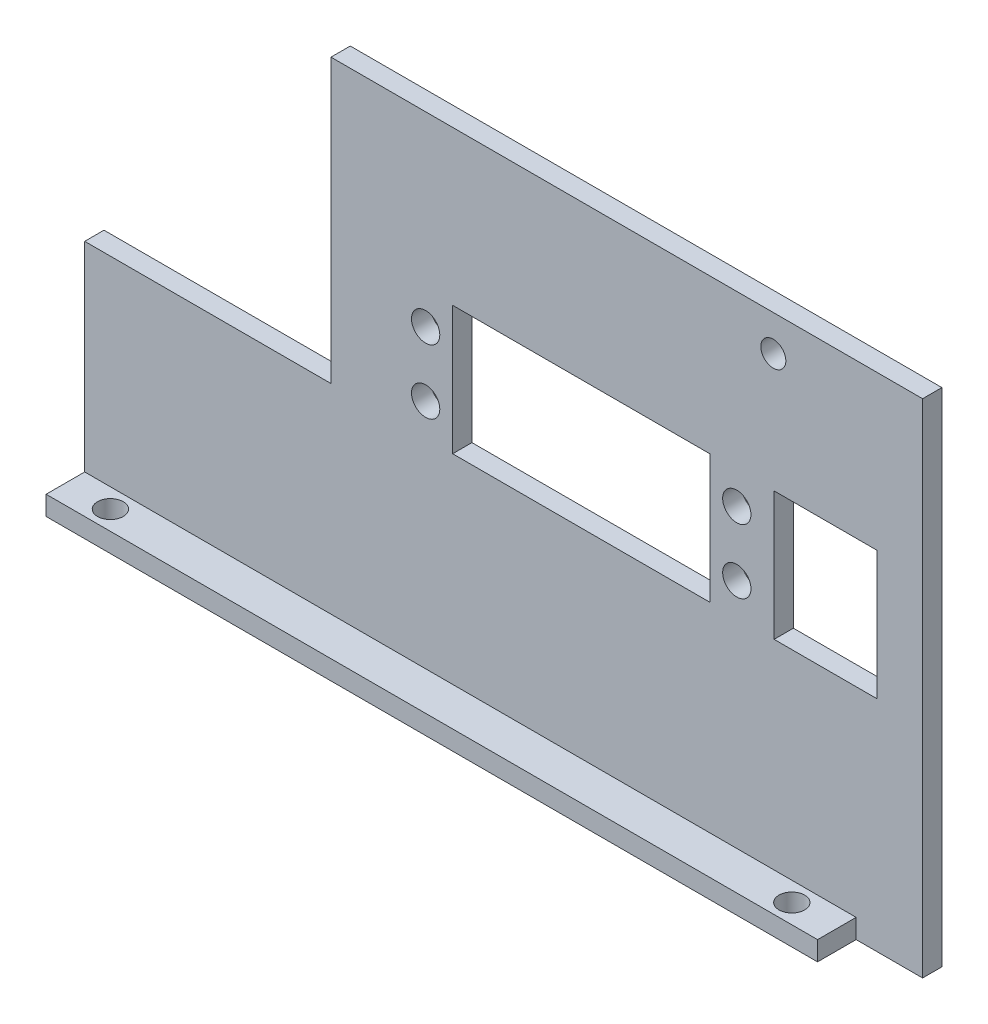
ISO-10303-21;
HEADER;
FILE_DESCRIPTION(('STEP AP214'),'2;1');
FILE_NAME('part.step','',(''),(''),'','','');
FILE_SCHEMA(('AUTOMOTIVE_DESIGN { 1 0 10303 214 1 1 1 1 }'));
ENDSEC;
DATA;
#1=APPLICATION_CONTEXT('core data for automotive mechanical design processes');
#2=APPLICATION_PROTOCOL_DEFINITION('international standard','automotive_design',2000,#1);
#3=PRODUCT_CONTEXT('',#1,'mechanical');
#4=PRODUCT('Part','Part','',(#3));
#5=PRODUCT_RELATED_PRODUCT_CATEGORY('part','',(#4));
#6=PRODUCT_DEFINITION_FORMATION('','',#4);
#7=PRODUCT_DEFINITION_CONTEXT('part definition',#1,'design');
#8=PRODUCT_DEFINITION('design','',#6,#7);
#9=PRODUCT_DEFINITION_SHAPE('','',#8);
#10=(LENGTH_UNIT() NAMED_UNIT(*) SI_UNIT(.MILLI.,.METRE.));
#11=(NAMED_UNIT(*) PLANE_ANGLE_UNIT() SI_UNIT($,.RADIAN.));
#12=(NAMED_UNIT(*) SI_UNIT($,.STERADIAN.) SOLID_ANGLE_UNIT());
#13=UNCERTAINTY_MEASURE_WITH_UNIT(LENGTH_MEASURE(1.E-05),#10,'distance_accuracy_value','');
#14=(GEOMETRIC_REPRESENTATION_CONTEXT(3) GLOBAL_UNCERTAINTY_ASSIGNED_CONTEXT((#13)) GLOBAL_UNIT_ASSIGNED_CONTEXT((#10,
#11,#12)) REPRESENTATION_CONTEXT('',''));
#15=CARTESIAN_POINT('',(0.,0.,0.));
#16=DIRECTION('',(0.,0.,1.));
#17=DIRECTION('',(1.,0.,0.));
#18=AXIS2_PLACEMENT_3D('',#15,#16,#17);
#19=CARTESIAN_POINT('',(0.,0.,1.5));
#20=DIRECTION('',(0.,0.,1.));
#21=DIRECTION('',(1.,0.,0.));
#22=AXIS2_PLACEMENT_3D('',#19,#20,#21);
#23=PLANE('',#22);
#24=DIRECTION('',(-1.,0.,0.));
#25=VECTOR('',#24,1.);
#26=CARTESIAN_POINT('',(81.6037037170651,-42.3491391233582,1.5));
#27=LINE('',#26,#25);
#28=CARTESIAN_POINT('',(81.6037037170651,-42.3491391233582,1.5));
#29=VERTEX_POINT('',#28);
#30=CARTESIAN_POINT('',(-38.3962962829349,-42.3491391233582,1.5));
#31=VERTEX_POINT('',#30);
#32=EDGE_CURVE('E179',#29,#31,#27,.T.);
#33=ORIENTED_EDGE('',*,*,#32,.F.);
#34=DIRECTION('',(0.,1.,0.));
#35=VECTOR('',#34,1.);
#36=CARTESIAN_POINT('',(81.6037037170651,-45.3491391233582,1.5));
#37=LINE('',#36,#35);
#38=CARTESIAN_POINT('',(81.6037037170651,-45.3491391233582,1.5));
#39=VERTEX_POINT('',#38);
#40=EDGE_CURVE('E49',#39,#29,#37,.T.);
#41=ORIENTED_EDGE('',*,*,#40,.F.);
#42=DIRECTION('',(1.,0.,0.));
#43=VECTOR('',#42,1.);
#44=CARTESIAN_POINT('',(-38.3962962829349,-45.3491391233582,1.5));
#45=LINE('',#44,#43);
#46=CARTESIAN_POINT('',(91.9435635315684,-45.3491391233582,1.5));
#47=VERTEX_POINT('',#46);
#48=EDGE_CURVE('E299',#39,#47,#45,.T.);
#49=ORIENTED_EDGE('',*,*,#48,.T.);
#50=DIRECTION('',(0.,1.,0.));
#51=VECTOR('',#50,1.);
#52=CARTESIAN_POINT('',(91.9435635315684,32.6887387273635,1.5));
#53=LINE('',#52,#51);
#54=CARTESIAN_POINT('',(91.9435635315684,32.6887387273635,1.5));
#55=VERTEX_POINT('',#54);
#56=EDGE_CURVE('E288',#47,#55,#53,.T.);
#57=ORIENTED_EDGE('',*,*,#56,.T.);
#58=DIRECTION('',(-1.,0.,0.));
#59=VECTOR('',#58,1.);
#60=CARTESIAN_POINT('',(-0.0842383477554077,32.6887387273635,1.5));
#61=LINE('',#60,#59);
#62=CARTESIAN_POINT('',(-0.0842383477554077,32.6887387273635,1.5));
#63=VERTEX_POINT('',#62);
#64=EDGE_CURVE('E291',#55,#63,#61,.T.);
#65=ORIENTED_EDGE('',*,*,#64,.T.);
#66=DIRECTION('',(0.,-1.,0.));
#67=VECTOR('',#66,1.);
#68=CARTESIAN_POINT('',(-0.0842383477554072,8.72215593269896,1.5));
#69=LINE('',#68,#67);
#70=CARTESIAN_POINT('',(-0.0842383477554047,-11.277844067301,1.5));
#71=VERTEX_POINT('',#70);
#72=EDGE_CURVE('E294',#63,#71,#69,.T.);
#73=ORIENTED_EDGE('',*,*,#72,.T.);
#74=DIRECTION('',(-1.,0.,0.));
#75=VECTOR('',#74,1.);
#76=CARTESIAN_POINT('',(-0.0842383477554047,-11.277844067301,1.5));
#77=LINE('',#76,#75);
#78=CARTESIAN_POINT('',(-38.3962962829349,-11.277844067301,1.5));
#79=VERTEX_POINT('',#78);
#80=EDGE_CURVE('E296',#71,#79,#77,.T.);
#81=ORIENTED_EDGE('',*,*,#80,.T.);
#82=DIRECTION('',(0.,-1.,0.));
#83=VECTOR('',#82,1.);
#84=CARTESIAN_POINT('',(-38.3962962829349,-11.277844067301,1.5));
#85=LINE('',#84,#83);
#86=EDGE_CURVE('E55',#79,#31,#85,.T.);
#87=ORIENTED_EDGE('',*,*,#86,.T.);
#88=EDGE_LOOP('',(#33,#41,#49,#57,#65,#73,#81,#87));
#89=FACE_BOUND('',#88,.T.);
#90=CARTESIAN_POINT('',(63.041461984655,3.72215593269896,1.5));
#91=DIRECTION('',(0.,0.,1.));
#92=DIRECTION('',(1.,0.,0.));
#93=AXIS2_PLACEMENT_3D('',#90,#91,#92);
#94=CIRCLE('',#93,2.2);
#95=CARTESIAN_POINT('',(65.241461984655,3.72215593269896,1.5));
#96=VERTEX_POINT('',#95);
#97=EDGE_CURVE('E233',#96,#96,#94,.T.);
#98=ORIENTED_EDGE('',*,*,#97,.F.);
#99=EDGE_LOOP('',(#98));
#100=FACE_BOUND('',#99,.T.);
#101=CARTESIAN_POINT('',(68.7194911646115,27.1397149575249,1.5));
#102=DIRECTION('',(0.,0.,1.));
#103=DIRECTION('',(1.,0.,0.));
#104=AXIS2_PLACEMENT_3D('',#101,#102,#103);
#105=CIRCLE('',#104,1.95);
#106=CARTESIAN_POINT('',(70.6694911646114,27.1397149575249,1.5));
#107=VERTEX_POINT('',#106);
#108=EDGE_CURVE('E245',#107,#107,#105,.T.);
#109=ORIENTED_EDGE('',*,*,#108,.F.);
#110=EDGE_LOOP('',(#109));
#111=FACE_BOUND('',#110,.T.);
#112=DIRECTION('',(1.,0.,0.));
#113=VECTOR('',#112,1.);
#114=CARTESIAN_POINT('',(68.841461984655,-11.277844067301,1.5));
#115=LINE('',#114,#113);
#116=CARTESIAN_POINT('',(68.841461984655,-11.277844067301,1.5));
#117=VERTEX_POINT('',#116);
#118=CARTESIAN_POINT('',(84.841461984655,-11.277844067301,1.5));
#119=VERTEX_POINT('',#118);
#120=EDGE_CURVE('E259',#117,#119,#115,.T.);
#121=ORIENTED_EDGE('',*,*,#120,.F.);
#122=DIRECTION('',(0.,-1.,0.));
#123=VECTOR('',#122,1.);
#124=CARTESIAN_POINT('',(68.841461984655,-11.277844067301,1.5));
#125=LINE('',#124,#123);
#126=CARTESIAN_POINT('',(68.841461984655,8.72215593269894,1.5));
#127=VERTEX_POINT('',#126);
#128=EDGE_CURVE('E257',#127,#117,#125,.T.);
#129=ORIENTED_EDGE('',*,*,#128,.F.);
#130=DIRECTION('',(-1.,0.,0.));
#131=VECTOR('',#130,1.);
#132=CARTESIAN_POINT('',(68.841461984655,8.72215593269894,1.5));
#133=LINE('',#132,#131);
#134=CARTESIAN_POINT('',(84.841461984655,8.72215593269894,1.5));
#135=VERTEX_POINT('',#134);
#136=EDGE_CURVE('E265',#135,#127,#133,.T.);
#137=ORIENTED_EDGE('',*,*,#136,.F.);
#138=DIRECTION('',(0.,1.,0.));
#139=VECTOR('',#138,1.);
#140=CARTESIAN_POINT('',(84.841461984655,-11.277844067301,1.5));
#141=LINE('',#140,#139);
#142=EDGE_CURVE('E262',#119,#135,#141,.T.);
#143=ORIENTED_EDGE('',*,*,#142,.F.);
#144=EDGE_LOOP('',(#121,#129,#137,#143));
#145=FACE_BOUND('',#144,.T.);
#146=CARTESIAN_POINT('',(14.641461984655,-6.27784406730104,1.5));
#147=DIRECTION('',(0.,0.,1.));
#148=DIRECTION('',(1.,0.,0.));
#149=AXIS2_PLACEMENT_3D('',#146,#147,#148);
#150=CIRCLE('',#149,2.2);
#151=CARTESIAN_POINT('',(16.841461984655,-6.27784406730104,1.5));
#152=VERTEX_POINT('',#151);
#153=EDGE_CURVE('E251',#152,#152,#150,.T.);
#154=ORIENTED_EDGE('',*,*,#153,.F.);
#155=EDGE_LOOP('',(#154));
#156=FACE_BOUND('',#155,.T.);
#157=CARTESIAN_POINT('',(14.641461984655,3.72215593269896,1.5));
#158=DIRECTION('',(0.,0.,1.));
#159=DIRECTION('',(1.,0.,0.));
#160=AXIS2_PLACEMENT_3D('',#157,#158,#159);
#161=CIRCLE('',#160,2.2);
#162=CARTESIAN_POINT('',(16.841461984655,3.72215593269896,1.5));
#163=VERTEX_POINT('',#162);
#164=EDGE_CURVE('E239',#163,#163,#161,.T.);
#165=ORIENTED_EDGE('',*,*,#164,.F.);
#166=EDGE_LOOP('',(#165));
#167=FACE_BOUND('',#166,.T.);
#168=CARTESIAN_POINT('',(63.041461984655,-6.27784406730104,1.5));
#169=DIRECTION('',(0.,0.,1.));
#170=DIRECTION('',(1.,0.,0.));
#171=AXIS2_PLACEMENT_3D('',#168,#169,#170);
#172=CIRCLE('',#171,2.2);
#173=CARTESIAN_POINT('',(65.241461984655,-6.27784406730104,1.5));
#174=VERTEX_POINT('',#173);
#175=EDGE_CURVE('E227',#174,#174,#172,.T.);
#176=ORIENTED_EDGE('',*,*,#175,.F.);
#177=EDGE_LOOP('',(#176));
#178=FACE_BOUND('',#177,.T.);
#179=DIRECTION('',(0.,-1.,0.));
#180=VECTOR('',#179,1.);
#181=CARTESIAN_POINT('',(18.841461984655,8.72215593269896,1.5));
#182=LINE('',#181,#180);
#183=CARTESIAN_POINT('',(18.841461984655,8.72215593269896,1.5));
#184=VERTEX_POINT('',#183);
#185=CARTESIAN_POINT('',(18.841461984655,-11.277844067301,1.5));
#186=VERTEX_POINT('',#185);
#187=EDGE_CURVE('E198',#184,#186,#182,.T.);
#188=ORIENTED_EDGE('',*,*,#187,.F.);
#189=DIRECTION('',(-1.,0.,0.));
#190=VECTOR('',#189,1.);
#191=CARTESIAN_POINT('',(18.841461984655,8.72215593269896,1.5));
#192=LINE('',#191,#190);
#193=CARTESIAN_POINT('',(58.841461984655,8.72215593269896,1.5));
#194=VERTEX_POINT('',#193);
#195=EDGE_CURVE('E196',#194,#184,#192,.T.);
#196=ORIENTED_EDGE('',*,*,#195,.F.);
#197=DIRECTION('',(0.,1.,0.));
#198=VECTOR('',#197,1.);
#199=CARTESIAN_POINT('',(58.841461984655,8.72215593269896,1.5));
#200=LINE('',#199,#198);
#201=CARTESIAN_POINT('',(58.841461984655,-11.277844067301,1.5));
#202=VERTEX_POINT('',#201);
#203=EDGE_CURVE('E204',#202,#194,#200,.T.);
#204=ORIENTED_EDGE('',*,*,#203,.F.);
#205=DIRECTION('',(1.,0.,0.));
#206=VECTOR('',#205,1.);
#207=CARTESIAN_POINT('',(18.841461984655,-11.277844067301,1.5));
#208=LINE('',#207,#206);
#209=EDGE_CURVE('E201',#186,#202,#208,.T.);
#210=ORIENTED_EDGE('',*,*,#209,.F.);
#211=EDGE_LOOP('',(#188,#196,#204,#210));
#212=FACE_BOUND('',#211,.T.);
#213=ADVANCED_FACE('F34',(#89,#100,#111,#145,#156,#167,#178,#212),#23,.T.);
#214=CARTESIAN_POINT('',(0.,0.,-1.5));
#215=DIRECTION('',(0.,0.,1.));
#216=DIRECTION('',(1.,0.,0.));
#217=AXIS2_PLACEMENT_3D('',#214,#215,#216);
#218=PLANE('',#217);
#219=CARTESIAN_POINT('',(63.041461984655,-6.27784406730104,-1.5));
#220=DIRECTION('',(0.,0.,1.));
#221=DIRECTION('',(1.,0.,0.));
#222=AXIS2_PLACEMENT_3D('',#219,#220,#221);
#223=CIRCLE('',#222,2.2);
#224=CARTESIAN_POINT('',(65.241461984655,-6.27784406730104,-1.5));
#225=VERTEX_POINT('',#224);
#226=EDGE_CURVE('E226',#225,#225,#223,.T.);
#227=ORIENTED_EDGE('',*,*,#226,.T.);
#228=EDGE_LOOP('',(#227));
#229=FACE_BOUND('',#228,.T.);
#230=CARTESIAN_POINT('',(63.041461984655,3.72215593269896,-1.5));
#231=DIRECTION('',(0.,0.,1.));
#232=DIRECTION('',(1.,0.,0.));
#233=AXIS2_PLACEMENT_3D('',#230,#231,#232);
#234=CIRCLE('',#233,2.2);
#235=CARTESIAN_POINT('',(65.241461984655,3.72215593269896,-1.5));
#236=VERTEX_POINT('',#235);
#237=EDGE_CURVE('E230',#236,#236,#234,.T.);
#238=ORIENTED_EDGE('',*,*,#237,.T.);
#239=EDGE_LOOP('',(#238));
#240=FACE_BOUND('',#239,.T.);
#241=CARTESIAN_POINT('',(14.641461984655,3.72215593269896,-1.5));
#242=DIRECTION('',(0.,0.,1.));
#243=DIRECTION('',(1.,0.,0.));
#244=AXIS2_PLACEMENT_3D('',#241,#242,#243);
#245=CIRCLE('',#244,2.2);
#246=CARTESIAN_POINT('',(16.841461984655,3.72215593269896,-1.5));
#247=VERTEX_POINT('',#246);
#248=EDGE_CURVE('E236',#247,#247,#245,.T.);
#249=ORIENTED_EDGE('',*,*,#248,.T.);
#250=EDGE_LOOP('',(#249));
#251=FACE_BOUND('',#250,.T.);
#252=CARTESIAN_POINT('',(68.7194911646115,27.1397149575249,-1.5));
#253=DIRECTION('',(0.,0.,1.));
#254=DIRECTION('',(1.,0.,0.));
#255=AXIS2_PLACEMENT_3D('',#252,#253,#254);
#256=CIRCLE('',#255,1.95);
#257=CARTESIAN_POINT('',(70.6694911646114,27.1397149575249,-1.5));
#258=VERTEX_POINT('',#257);
#259=EDGE_CURVE('E242',#258,#258,#256,.T.);
#260=ORIENTED_EDGE('',*,*,#259,.T.);
#261=EDGE_LOOP('',(#260));
#262=FACE_BOUND('',#261,.T.);
#263=CARTESIAN_POINT('',(14.641461984655,-6.27784406730104,-1.5));
#264=DIRECTION('',(0.,0.,1.));
#265=DIRECTION('',(1.,0.,0.));
#266=AXIS2_PLACEMENT_3D('',#263,#264,#265);
#267=CIRCLE('',#266,2.2);
#268=CARTESIAN_POINT('',(16.841461984655,-6.27784406730104,-1.5));
#269=VERTEX_POINT('',#268);
#270=EDGE_CURVE('E248',#269,#269,#267,.T.);
#271=ORIENTED_EDGE('',*,*,#270,.T.);
#272=EDGE_LOOP('',(#271));
#273=FACE_BOUND('',#272,.T.);
#274=DIRECTION('',(0.,-1.,0.));
#275=VECTOR('',#274,1.);
#276=CARTESIAN_POINT('',(68.841461984655,-11.277844067301,-1.5));
#277=LINE('',#276,#275);
#278=CARTESIAN_POINT('',(68.841461984655,8.72215593269894,-1.5));
#279=VERTEX_POINT('',#278);
#280=CARTESIAN_POINT('',(68.841461984655,-11.277844067301,-1.5));
#281=VERTEX_POINT('',#280);
#282=EDGE_CURVE('E254',#279,#281,#277,.T.);
#283=ORIENTED_EDGE('',*,*,#282,.T.);
#284=DIRECTION('',(1.,0.,0.));
#285=VECTOR('',#284,1.);
#286=CARTESIAN_POINT('',(68.841461984655,-11.277844067301,-1.5));
#287=LINE('',#286,#285);
#288=CARTESIAN_POINT('',(84.841461984655,-11.277844067301,-1.5));
#289=VERTEX_POINT('',#288);
#290=EDGE_CURVE('E270',#281,#289,#287,.T.);
#291=ORIENTED_EDGE('',*,*,#290,.T.);
#292=DIRECTION('',(0.,1.,0.));
#293=VECTOR('',#292,1.);
#294=CARTESIAN_POINT('',(84.841461984655,-11.277844067301,-1.5));
#295=LINE('',#294,#293);
#296=CARTESIAN_POINT('',(84.841461984655,8.72215593269894,-1.5));
#297=VERTEX_POINT('',#296);
#298=EDGE_CURVE('E273',#289,#297,#295,.T.);
#299=ORIENTED_EDGE('',*,*,#298,.T.);
#300=DIRECTION('',(-1.,0.,0.));
#301=VECTOR('',#300,1.);
#302=CARTESIAN_POINT('',(68.841461984655,8.72215593269894,-1.5));
#303=LINE('',#302,#301);
#304=EDGE_CURVE('E260',#297,#279,#303,.T.);
#305=ORIENTED_EDGE('',*,*,#304,.T.);
#306=EDGE_LOOP('',(#283,#291,#299,#305));
#307=FACE_BOUND('',#306,.T.);
#308=DIRECTION('',(0.,1.,0.));
#309=VECTOR('',#308,1.);
#310=CARTESIAN_POINT('',(91.9435635315684,32.6887387273635,-1.5));
#311=LINE('',#310,#309);
#312=CARTESIAN_POINT('',(91.9435635315684,-45.3491391233582,-1.5));
#313=VERTEX_POINT('',#312);
#314=CARTESIAN_POINT('',(91.9435635315684,32.6887387273635,-1.5));
#315=VERTEX_POINT('',#314);
#316=EDGE_CURVE('E287',#313,#315,#311,.T.);
#317=ORIENTED_EDGE('',*,*,#316,.F.);
#318=DIRECTION('',(1.,0.,0.));
#319=VECTOR('',#318,1.);
#320=CARTESIAN_POINT('',(-38.3962962829349,-45.3491391233582,-1.5));
#321=LINE('',#320,#319);
#322=CARTESIAN_POINT('',(-38.3962962829349,-45.3491391233582,-1.5));
#323=VERTEX_POINT('',#322);
#324=EDGE_CURVE('E292',#323,#313,#321,.T.);
#325=ORIENTED_EDGE('',*,*,#324,.F.);
#326=DIRECTION('',(0.,-1.,0.));
#327=VECTOR('',#326,1.);
#328=CARTESIAN_POINT('',(-38.3962962829349,-11.277844067301,-1.5));
#329=LINE('',#328,#327);
#330=CARTESIAN_POINT('',(-38.3962962829349,-11.277844067301,-1.5));
#331=VERTEX_POINT('',#330);
#332=EDGE_CURVE('E160',#331,#323,#329,.T.);
#333=ORIENTED_EDGE('',*,*,#332,.F.);
#334=DIRECTION('',(-1.,0.,0.));
#335=VECTOR('',#334,1.);
#336=CARTESIAN_POINT('',(-17.0842383477554,-11.277844067301,-1.5));
#337=LINE('',#336,#335);
#338=CARTESIAN_POINT('',(-0.0842383477554047,-11.277844067301,-1.5));
#339=VERTEX_POINT('',#338);
#340=EDGE_CURVE('E309',#339,#331,#337,.T.);
#341=ORIENTED_EDGE('',*,*,#340,.F.);
#342=DIRECTION('',(0.,-1.,0.));
#343=VECTOR('',#342,1.);
#344=CARTESIAN_POINT('',(-0.0842383477554072,8.72215593269896,-1.5));
#345=LINE('',#344,#343);
#346=CARTESIAN_POINT('',(-0.0842383477554077,32.6887387273635,-1.5));
#347=VERTEX_POINT('',#346);
#348=EDGE_CURVE('E306',#347,#339,#345,.T.);
#349=ORIENTED_EDGE('',*,*,#348,.F.);
#350=DIRECTION('',(-1.,0.,0.));
#351=VECTOR('',#350,1.);
#352=CARTESIAN_POINT('',(-0.0842383477554077,32.6887387273635,-1.5));
#353=LINE('',#352,#351);
#354=EDGE_CURVE('E303',#315,#347,#353,.T.);
#355=ORIENTED_EDGE('',*,*,#354,.F.);
#356=EDGE_LOOP('',(#317,#325,#333,#341,#349,#355));
#357=FACE_BOUND('',#356,.T.);
#358=DIRECTION('',(-1.,0.,0.));
#359=VECTOR('',#358,1.);
#360=CARTESIAN_POINT('',(18.841461984655,8.72215593269896,-1.5));
#361=LINE('',#360,#359);
#362=CARTESIAN_POINT('',(58.841461984655,8.72215593269896,-1.5));
#363=VERTEX_POINT('',#362);
#364=CARTESIAN_POINT('',(18.841461984655,8.72215593269896,-1.5));
#365=VERTEX_POINT('',#364);
#366=EDGE_CURVE('E195',#363,#365,#361,.T.);
#367=ORIENTED_EDGE('',*,*,#366,.T.);
#368=DIRECTION('',(0.,-1.,0.));
#369=VECTOR('',#368,1.);
#370=CARTESIAN_POINT('',(18.841461984655,8.72215593269896,-1.5));
#371=LINE('',#370,#369);
#372=CARTESIAN_POINT('',(18.841461984655,-11.277844067301,-1.5));
#373=VERTEX_POINT('',#372);
#374=EDGE_CURVE('E209',#365,#373,#371,.T.);
#375=ORIENTED_EDGE('',*,*,#374,.T.);
#376=DIRECTION('',(1.,0.,0.));
#377=VECTOR('',#376,1.);
#378=CARTESIAN_POINT('',(18.841461984655,-11.277844067301,-1.5));
#379=LINE('',#378,#377);
#380=CARTESIAN_POINT('',(58.841461984655,-11.277844067301,-1.5));
#381=VERTEX_POINT('',#380);
#382=EDGE_CURVE('E212',#373,#381,#379,.T.);
#383=ORIENTED_EDGE('',*,*,#382,.T.);
#384=DIRECTION('',(0.,1.,0.));
#385=VECTOR('',#384,1.);
#386=CARTESIAN_POINT('',(58.841461984655,8.72215593269896,-1.5));
#387=LINE('',#386,#385);
#388=EDGE_CURVE('E199',#381,#363,#387,.T.);
#389=ORIENTED_EDGE('',*,*,#388,.T.);
#390=EDGE_LOOP('',(#367,#375,#383,#389));
#391=FACE_BOUND('',#390,.T.);
#392=ADVANCED_FACE('F329',(#229,#240,#251,#262,#273,#307,#357,#391),#218,.F.);
#393=CARTESIAN_POINT('',(91.9435635315684,32.6887387273635,1.5));
#394=DIRECTION('',(-1.,0.,0.));
#395=DIRECTION('',(0.,0.,1.));
#396=AXIS2_PLACEMENT_3D('',#393,#394,#395);
#397=PLANE('',#396);
#398=ORIENTED_EDGE('',*,*,#316,.T.);
#399=DIRECTION('',(0.,0.,-1.));
#400=VECTOR('',#399,1.);
#401=CARTESIAN_POINT('',(91.9435635315684,32.6887387273635,1.5));
#402=LINE('',#401,#400);
#403=EDGE_CURVE('E11',#55,#315,#402,.T.);
#404=ORIENTED_EDGE('',*,*,#403,.F.);
#405=ORIENTED_EDGE('',*,*,#56,.F.);
#406=DIRECTION('',(0.,0.,-1.));
#407=VECTOR('',#406,1.);
#408=CARTESIAN_POINT('',(91.9435635315684,-45.3491391233582,1.5));
#409=LINE('',#408,#407);
#410=EDGE_CURVE('E164',#47,#313,#409,.T.);
#411=ORIENTED_EDGE('',*,*,#410,.T.);
#412=EDGE_LOOP('',(#398,#404,#405,#411));
#413=FACE_BOUND('',#412,.T.);
#414=ADVANCED_FACE('F36',(#413),#397,.F.);
#415=CARTESIAN_POINT('',(-0.0842383477554077,32.6887387273635,1.5));
#416=DIRECTION('',(0.,-1.,0.));
#417=DIRECTION('',(0.,0.,-1.));
#418=AXIS2_PLACEMENT_3D('',#415,#416,#417);
#419=PLANE('',#418);
#420=ORIENTED_EDGE('',*,*,#354,.T.);
#421=DIRECTION('',(0.,0.,-1.));
#422=VECTOR('',#421,1.);
#423=CARTESIAN_POINT('',(-0.0842383477554077,32.6887387273635,1.5));
#424=LINE('',#423,#422);
#425=EDGE_CURVE('E42',#63,#347,#424,.T.);
#426=ORIENTED_EDGE('',*,*,#425,.F.);
#427=ORIENTED_EDGE('',*,*,#64,.F.);
#428=ORIENTED_EDGE('',*,*,#403,.T.);
#429=EDGE_LOOP('',(#420,#426,#427,#428));
#430=FACE_BOUND('',#429,.T.);
#431=ADVANCED_FACE('F325',(#430),#419,.F.);
#432=CARTESIAN_POINT('',(-0.0842383477554072,8.72215593269896,1.5));
#433=DIRECTION('',(1.,0.,0.));
#434=DIRECTION('',(0.,1.,0.));
#435=AXIS2_PLACEMENT_3D('',#432,#433,#434);
#436=PLANE('',#435);
#437=ORIENTED_EDGE('',*,*,#348,.T.);
#438=DIRECTION('',(0.,0.,-1.));
#439=VECTOR('',#438,1.);
#440=CARTESIAN_POINT('',(-0.0842383477554047,-11.277844067301,1.5));
#441=LINE('',#440,#439);
#442=EDGE_CURVE('E316',#71,#339,#441,.T.);
#443=ORIENTED_EDGE('',*,*,#442,.F.);
#444=ORIENTED_EDGE('',*,*,#72,.F.);
#445=ORIENTED_EDGE('',*,*,#425,.T.);
#446=EDGE_LOOP('',(#437,#443,#444,#445));
#447=FACE_BOUND('',#446,.T.);
#448=ADVANCED_FACE('F322',(#447),#436,.F.);
#449=CARTESIAN_POINT('',(-17.0842383477554,-11.277844067301,1.5));
#450=DIRECTION('',(0.,-1.,0.));
#451=DIRECTION('',(1.,0.,0.));
#452=AXIS2_PLACEMENT_3D('',#449,#450,#451);
#453=PLANE('',#452);
#454=ORIENTED_EDGE('',*,*,#340,.T.);
#455=DIRECTION('',(0.,0.,-1.));
#456=VECTOR('',#455,1.);
#457=CARTESIAN_POINT('',(-38.3962962829349,-11.277844067301,1.5));
#458=LINE('',#457,#456);
#459=EDGE_CURVE('E163',#79,#331,#458,.T.);
#460=ORIENTED_EDGE('',*,*,#459,.F.);
#461=ORIENTED_EDGE('',*,*,#80,.F.);
#462=ORIENTED_EDGE('',*,*,#442,.T.);
#463=EDGE_LOOP('',(#454,#460,#461,#462));
#464=FACE_BOUND('',#463,.T.);
#465=ADVANCED_FACE('F333',(#464),#453,.F.);
#466=CARTESIAN_POINT('',(-38.3962962829349,-11.277844067301,1.5));
#467=DIRECTION('',(1.,0.,0.));
#468=DIRECTION('',(0.,0.,-1.));
#469=AXIS2_PLACEMENT_3D('',#466,#467,#468);
#470=PLANE('',#469);
#471=ORIENTED_EDGE('',*,*,#332,.T.);
#472=DIRECTION('',(0.,0.,-1.));
#473=VECTOR('',#472,1.);
#474=CARTESIAN_POINT('',(-38.3962962829349,-45.3491391233582,1.5));
#475=LINE('',#474,#473);
#476=CARTESIAN_POINT('',(-38.3962962829349,-45.3491391233582,7.5));
#477=VERTEX_POINT('',#476);
#478=EDGE_CURVE('E152',#477,#323,#475,.T.);
#479=ORIENTED_EDGE('',*,*,#478,.F.);
#480=DIRECTION('',(0.,-1.,0.));
#481=VECTOR('',#480,1.);
#482=CARTESIAN_POINT('',(-38.3962962829349,-42.3491391233582,7.5));
#483=LINE('',#482,#481);
#484=CARTESIAN_POINT('',(-38.3962962829349,-42.3491391233582,7.5));
#485=VERTEX_POINT('',#484);
#486=EDGE_CURVE('E157',#485,#477,#483,.T.);
#487=ORIENTED_EDGE('',*,*,#486,.F.);
#488=DIRECTION('',(0.,0.,-1.));
#489=VECTOR('',#488,1.);
#490=CARTESIAN_POINT('',(-38.3962962829349,-42.3491391233582,7.5));
#491=LINE('',#490,#489);
#492=EDGE_CURVE('E188',#485,#31,#491,.T.);
#493=ORIENTED_EDGE('',*,*,#492,.T.);
#494=ORIENTED_EDGE('',*,*,#86,.F.);
#495=ORIENTED_EDGE('',*,*,#459,.T.);
#496=EDGE_LOOP('',(#471,#479,#487,#493,#494,#495));
#497=FACE_BOUND('',#496,.T.);
#498=ADVANCED_FACE('F154',(#497),#470,.F.);
#499=CARTESIAN_POINT('',(-38.3962962829349,-45.3491391233582,1.5));
#500=DIRECTION('',(0.,1.,0.));
#501=DIRECTION('',(0.,0.,1.));
#502=AXIS2_PLACEMENT_3D('',#499,#500,#501);
#503=PLANE('',#502);
#504=CARTESIAN_POINT('',(-31.3962962829349,-45.3491391233582,4.5));
#505=DIRECTION('',(0.,1.,0.));
#506=DIRECTION('',(0.,0.,1.));
#507=AXIS2_PLACEMENT_3D('',#504,#505,#506);
#508=CIRCLE('',#507,2.);
#509=CARTESIAN_POINT('',(-31.3962962829349,-45.3491391233582,6.5));
#510=VERTEX_POINT('',#509);
#511=EDGE_CURVE('E183',#510,#510,#508,.T.);
#512=ORIENTED_EDGE('',*,*,#511,.T.);
#513=EDGE_LOOP('',(#512));
#514=FACE_BOUND('',#513,.T.);
#515=CARTESIAN_POINT('',(74.6037037170651,-45.3491391233582,4.5));
#516=DIRECTION('',(0.,1.,0.));
#517=DIRECTION('',(0.,0.,1.));
#518=AXIS2_PLACEMENT_3D('',#515,#516,#517);
#519=CIRCLE('',#518,2.);
#520=CARTESIAN_POINT('',(74.6037037170651,-45.3491391233582,6.5));
#521=VERTEX_POINT('',#520);
#522=EDGE_CURVE('E591',#521,#521,#519,.T.);
#523=ORIENTED_EDGE('',*,*,#522,.T.);
#524=EDGE_LOOP('',(#523));
#525=FACE_BOUND('',#524,.T.);
#526=ORIENTED_EDGE('',*,*,#324,.T.);
#527=ORIENTED_EDGE('',*,*,#410,.F.);
#528=ORIENTED_EDGE('',*,*,#48,.F.);
#529=DIRECTION('',(0.,0.,-1.));
#530=VECTOR('',#529,1.);
#531=CARTESIAN_POINT('',(81.6037037170651,-45.3491391233582,7.5));
#532=LINE('',#531,#530);
#533=CARTESIAN_POINT('',(81.6037037170651,-45.3491391233582,7.5));
#534=VERTEX_POINT('',#533);
#535=EDGE_CURVE('E170',#534,#39,#532,.T.);
#536=ORIENTED_EDGE('',*,*,#535,.F.);
#537=DIRECTION('',(1.,0.,0.));
#538=VECTOR('',#537,1.);
#539=CARTESIAN_POINT('',(-38.3962962829349,-45.3491391233582,7.5));
#540=LINE('',#539,#538);
#541=EDGE_CURVE('E167',#477,#534,#540,.T.);
#542=ORIENTED_EDGE('',*,*,#541,.F.);
#543=ORIENTED_EDGE('',*,*,#478,.T.);
#544=EDGE_LOOP('',(#526,#527,#528,#536,#542,#543));
#545=FACE_BOUND('',#544,.T.);
#546=ADVANCED_FACE('F168',(#514,#525,#545),#503,.F.);
#547=CARTESIAN_POINT('',(68.841461984655,-11.277844067301,1.5));
#548=DIRECTION('',(1.,0.,0.));
#549=DIRECTION('',(0.,0.,-1.));
#550=AXIS2_PLACEMENT_3D('',#547,#548,#549);
#551=PLANE('',#550);
#552=ORIENTED_EDGE('',*,*,#282,.F.);
#553=DIRECTION('',(0.,0.,-1.));
#554=VECTOR('',#553,1.);
#555=CARTESIAN_POINT('',(68.841461984655,8.72215593269894,1.5));
#556=LINE('',#555,#554);
#557=EDGE_CURVE('E267',#127,#279,#556,.T.);
#558=ORIENTED_EDGE('',*,*,#557,.F.);
#559=ORIENTED_EDGE('',*,*,#128,.T.);
#560=DIRECTION('',(0.,0.,-1.));
#561=VECTOR('',#560,1.);
#562=CARTESIAN_POINT('',(68.841461984655,-11.277844067301,1.5));
#563=LINE('',#562,#561);
#564=EDGE_CURVE('E284',#117,#281,#563,.T.);
#565=ORIENTED_EDGE('',*,*,#564,.T.);
#566=EDGE_LOOP('',(#552,#558,#559,#565));
#567=FACE_BOUND('',#566,.T.);
#568=ADVANCED_FACE('F361',(#567),#551,.T.);
#569=CARTESIAN_POINT('',(68.841461984655,-11.277844067301,1.5));
#570=DIRECTION('',(0.,1.,0.));
#571=DIRECTION('',(0.,0.,1.));
#572=AXIS2_PLACEMENT_3D('',#569,#570,#571);
#573=PLANE('',#572);
#574=ORIENTED_EDGE('',*,*,#290,.F.);
#575=ORIENTED_EDGE('',*,*,#564,.F.);
#576=ORIENTED_EDGE('',*,*,#120,.T.);
#577=DIRECTION('',(0.,0.,-1.));
#578=VECTOR('',#577,1.);
#579=CARTESIAN_POINT('',(84.841461984655,-11.277844067301,1.5));
#580=LINE('',#579,#578);
#581=EDGE_CURVE('E282',#119,#289,#580,.T.);
#582=ORIENTED_EDGE('',*,*,#581,.T.);
#583=EDGE_LOOP('',(#574,#575,#576,#582));
#584=FACE_BOUND('',#583,.T.);
#585=ADVANCED_FACE('F437',(#584),#573,.T.);
#586=CARTESIAN_POINT('',(84.841461984655,-11.277844067301,1.5));
#587=DIRECTION('',(-1.,0.,0.));
#588=DIRECTION('',(0.,0.,1.));
#589=AXIS2_PLACEMENT_3D('',#586,#587,#588);
#590=PLANE('',#589);
#591=ORIENTED_EDGE('',*,*,#298,.F.);
#592=ORIENTED_EDGE('',*,*,#581,.F.);
#593=ORIENTED_EDGE('',*,*,#142,.T.);
#594=DIRECTION('',(0.,0.,-1.));
#595=VECTOR('',#594,1.);
#596=CARTESIAN_POINT('',(84.841461984655,8.72215593269894,1.5));
#597=LINE('',#596,#595);
#598=EDGE_CURVE('E280',#135,#297,#597,.T.);
#599=ORIENTED_EDGE('',*,*,#598,.T.);
#600=EDGE_LOOP('',(#591,#592,#593,#599));
#601=FACE_BOUND('',#600,.T.);
#602=ADVANCED_FACE('F445',(#601),#590,.T.);
#603=CARTESIAN_POINT('',(68.841461984655,8.72215593269894,1.5));
#604=DIRECTION('',(0.,-1.,0.));
#605=DIRECTION('',(0.,0.,-1.));
#606=AXIS2_PLACEMENT_3D('',#603,#604,#605);
#607=PLANE('',#606);
#608=ORIENTED_EDGE('',*,*,#304,.F.);
#609=ORIENTED_EDGE('',*,*,#598,.F.);
#610=ORIENTED_EDGE('',*,*,#136,.T.);
#611=ORIENTED_EDGE('',*,*,#557,.T.);
#612=EDGE_LOOP('',(#608,#609,#610,#611));
#613=FACE_BOUND('',#612,.T.);
#614=ADVANCED_FACE('F453',(#613),#607,.T.);
#615=CARTESIAN_POINT('',(14.641461984655,-6.27784406730104,1.5));
#616=DIRECTION('',(0.,0.,-1.));
#617=DIRECTION('',(-1.,0.,0.));
#618=AXIS2_PLACEMENT_3D('',#615,#616,#617);
#619=CYLINDRICAL_SURFACE('',#618,2.2);
#620=ORIENTED_EDGE('',*,*,#153,.T.);
#621=EDGE_LOOP('',(#620));
#622=FACE_BOUND('',#621,.T.);
#623=ORIENTED_EDGE('',*,*,#270,.F.);
#624=EDGE_LOOP('',(#623));
#625=FACE_BOUND('',#624,.T.);
#626=ADVANCED_FACE('F462',(#622,#625),#619,.F.);
#627=CARTESIAN_POINT('',(68.7194911646115,27.1397149575249,1.5));
#628=DIRECTION('',(0.,0.,-1.));
#629=DIRECTION('',(-1.,0.,0.));
#630=AXIS2_PLACEMENT_3D('',#627,#628,#629);
#631=CYLINDRICAL_SURFACE('',#630,1.95);
#632=ORIENTED_EDGE('',*,*,#108,.T.);
#633=EDGE_LOOP('',(#632));
#634=FACE_BOUND('',#633,.T.);
#635=ORIENTED_EDGE('',*,*,#259,.F.);
#636=EDGE_LOOP('',(#635));
#637=FACE_BOUND('',#636,.T.);
#638=ADVANCED_FACE('F471',(#634,#637),#631,.F.);
#639=CARTESIAN_POINT('',(14.641461984655,3.72215593269896,1.5));
#640=DIRECTION('',(0.,0.,-1.));
#641=DIRECTION('',(-1.,0.,0.));
#642=AXIS2_PLACEMENT_3D('',#639,#640,#641);
#643=CYLINDRICAL_SURFACE('',#642,2.2);
#644=ORIENTED_EDGE('',*,*,#164,.T.);
#645=EDGE_LOOP('',(#644));
#646=FACE_BOUND('',#645,.T.);
#647=ORIENTED_EDGE('',*,*,#248,.F.);
#648=EDGE_LOOP('',(#647));
#649=FACE_BOUND('',#648,.T.);
#650=ADVANCED_FACE('F480',(#646,#649),#643,.F.);
#651=CARTESIAN_POINT('',(63.041461984655,3.72215593269896,1.5));
#652=DIRECTION('',(0.,0.,-1.));
#653=DIRECTION('',(-1.,0.,0.));
#654=AXIS2_PLACEMENT_3D('',#651,#652,#653);
#655=CYLINDRICAL_SURFACE('',#654,2.2);
#656=ORIENTED_EDGE('',*,*,#97,.T.);
#657=EDGE_LOOP('',(#656));
#658=FACE_BOUND('',#657,.T.);
#659=ORIENTED_EDGE('',*,*,#237,.F.);
#660=EDGE_LOOP('',(#659));
#661=FACE_BOUND('',#660,.T.);
#662=ADVANCED_FACE('F489',(#658,#661),#655,.F.);
#663=CARTESIAN_POINT('',(63.041461984655,-6.27784406730104,1.5));
#664=DIRECTION('',(0.,0.,-1.));
#665=DIRECTION('',(-1.,0.,0.));
#666=AXIS2_PLACEMENT_3D('',#663,#664,#665);
#667=CYLINDRICAL_SURFACE('',#666,2.2);
#668=ORIENTED_EDGE('',*,*,#175,.T.);
#669=EDGE_LOOP('',(#668));
#670=FACE_BOUND('',#669,.T.);
#671=ORIENTED_EDGE('',*,*,#226,.F.);
#672=EDGE_LOOP('',(#671));
#673=FACE_BOUND('',#672,.T.);
#674=ADVANCED_FACE('F498',(#670,#673),#667,.F.);
#675=CARTESIAN_POINT('',(18.841461984655,8.72215593269896,1.5));
#676=DIRECTION('',(0.,-1.,0.));
#677=DIRECTION('',(0.,0.,-1.));
#678=AXIS2_PLACEMENT_3D('',#675,#676,#677);
#679=PLANE('',#678);
#680=ORIENTED_EDGE('',*,*,#366,.F.);
#681=DIRECTION('',(0.,0.,-1.));
#682=VECTOR('',#681,1.);
#683=CARTESIAN_POINT('',(58.841461984655,8.72215593269896,1.5));
#684=LINE('',#683,#682);
#685=EDGE_CURVE('E206',#194,#363,#684,.T.);
#686=ORIENTED_EDGE('',*,*,#685,.F.);
#687=ORIENTED_EDGE('',*,*,#195,.T.);
#688=DIRECTION('',(0.,0.,-1.));
#689=VECTOR('',#688,1.);
#690=CARTESIAN_POINT('',(18.841461984655,8.72215593269896,1.5));
#691=LINE('',#690,#689);
#692=EDGE_CURVE('E223',#184,#365,#691,.T.);
#693=ORIENTED_EDGE('',*,*,#692,.T.);
#694=EDGE_LOOP('',(#680,#686,#687,#693));
#695=FACE_BOUND('',#694,.T.);
#696=ADVANCED_FACE('F507',(#695),#679,.T.);
#697=CARTESIAN_POINT('',(18.841461984655,8.72215593269896,1.5));
#698=DIRECTION('',(1.,0.,0.));
#699=DIRECTION('',(0.,1.,0.));
#700=AXIS2_PLACEMENT_3D('',#697,#698,#699);
#701=PLANE('',#700);
#702=ORIENTED_EDGE('',*,*,#374,.F.);
#703=ORIENTED_EDGE('',*,*,#692,.F.);
#704=ORIENTED_EDGE('',*,*,#187,.T.);
#705=DIRECTION('',(0.,0.,-1.));
#706=VECTOR('',#705,1.);
#707=CARTESIAN_POINT('',(18.841461984655,-11.277844067301,1.5));
#708=LINE('',#707,#706);
#709=EDGE_CURVE('E221',#186,#373,#708,.T.);
#710=ORIENTED_EDGE('',*,*,#709,.T.);
#711=EDGE_LOOP('',(#702,#703,#704,#710));
#712=FACE_BOUND('',#711,.T.);
#713=ADVANCED_FACE('F516',(#712),#701,.T.);
#714=CARTESIAN_POINT('',(18.841461984655,-11.277844067301,1.5));
#715=DIRECTION('',(0.,1.,0.));
#716=DIRECTION('',(0.,0.,1.));
#717=AXIS2_PLACEMENT_3D('',#714,#715,#716);
#718=PLANE('',#717);
#719=ORIENTED_EDGE('',*,*,#382,.F.);
#720=ORIENTED_EDGE('',*,*,#709,.F.);
#721=ORIENTED_EDGE('',*,*,#209,.T.);
#722=DIRECTION('',(0.,0.,-1.));
#723=VECTOR('',#722,1.);
#724=CARTESIAN_POINT('',(58.841461984655,-11.277844067301,1.5));
#725=LINE('',#724,#723);
#726=EDGE_CURVE('E219',#202,#381,#725,.T.);
#727=ORIENTED_EDGE('',*,*,#726,.T.);
#728=EDGE_LOOP('',(#719,#720,#721,#727));
#729=FACE_BOUND('',#728,.T.);
#730=ADVANCED_FACE('F350',(#729),#718,.T.);
#731=CARTESIAN_POINT('',(58.841461984655,8.72215593269896,1.5));
#732=DIRECTION('',(-1.,0.,0.));
#733=DIRECTION('',(0.,-1.,0.));
#734=AXIS2_PLACEMENT_3D('',#731,#732,#733);
#735=PLANE('',#734);
#736=ORIENTED_EDGE('',*,*,#388,.F.);
#737=ORIENTED_EDGE('',*,*,#726,.F.);
#738=ORIENTED_EDGE('',*,*,#203,.T.);
#739=ORIENTED_EDGE('',*,*,#685,.T.);
#740=EDGE_LOOP('',(#736,#737,#738,#739));
#741=FACE_BOUND('',#740,.T.);
#742=ADVANCED_FACE('F342',(#741),#735,.T.);
#743=CARTESIAN_POINT('',(81.6037037170651,-45.3491391233582,7.5));
#744=DIRECTION('',(-1.,0.,0.));
#745=DIRECTION('',(0.,0.,1.));
#746=AXIS2_PLACEMENT_3D('',#743,#744,#745);
#747=PLANE('',#746);
#748=ORIENTED_EDGE('',*,*,#40,.T.);
#749=DIRECTION('',(0.,0.,-1.));
#750=VECTOR('',#749,1.);
#751=CARTESIAN_POINT('',(81.6037037170651,-42.3491391233582,7.5));
#752=LINE('',#751,#750);
#753=CARTESIAN_POINT('',(81.6037037170651,-42.3491391233582,7.5));
#754=VERTEX_POINT('',#753);
#755=EDGE_CURVE('E191',#754,#29,#752,.T.);
#756=ORIENTED_EDGE('',*,*,#755,.F.);
#757=DIRECTION('',(0.,1.,0.));
#758=VECTOR('',#757,1.);
#759=CARTESIAN_POINT('',(81.6037037170651,-45.3491391233582,7.5));
#760=LINE('',#759,#758);
#761=EDGE_CURVE('E173',#534,#754,#760,.T.);
#762=ORIENTED_EDGE('',*,*,#761,.F.);
#763=ORIENTED_EDGE('',*,*,#535,.T.);
#764=EDGE_LOOP('',(#748,#756,#762,#763));
#765=FACE_BOUND('',#764,.T.);
#766=ADVANCED_FACE('F340',(#765),#747,.F.);
#767=CARTESIAN_POINT('',(81.6037037170651,-42.3491391233582,7.5));
#768=DIRECTION('',(0.,-1.,0.));
#769=DIRECTION('',(1.,0.,0.));
#770=AXIS2_PLACEMENT_3D('',#767,#768,#769);
#771=PLANE('',#770);
#772=CARTESIAN_POINT('',(-31.3962962829349,-42.3491391233582,4.5));
#773=DIRECTION('',(0.,1.,0.));
#774=DIRECTION('',(-1.,0.,0.));
#775=AXIS2_PLACEMENT_3D('',#772,#773,#774);
#776=CIRCLE('',#775,2.);
#777=CARTESIAN_POINT('',(-33.3962962829349,-42.3491391233582,4.5));
#778=VERTEX_POINT('',#777);
#779=EDGE_CURVE('E588',#778,#778,#776,.T.);
#780=ORIENTED_EDGE('',*,*,#779,.F.);
#781=EDGE_LOOP('',(#780));
#782=FACE_BOUND('',#781,.T.);
#783=CARTESIAN_POINT('',(74.6037037170651,-42.3491391233582,4.5));
#784=DIRECTION('',(0.,1.,0.));
#785=DIRECTION('',(-1.,0.,0.));
#786=AXIS2_PLACEMENT_3D('',#783,#784,#785);
#787=CIRCLE('',#786,2.);
#788=CARTESIAN_POINT('',(72.6037037170651,-42.3491391233582,4.5));
#789=VERTEX_POINT('',#788);
#790=EDGE_CURVE('E595',#789,#789,#787,.T.);
#791=ORIENTED_EDGE('',*,*,#790,.F.);
#792=EDGE_LOOP('',(#791));
#793=FACE_BOUND('',#792,.T.);
#794=ORIENTED_EDGE('',*,*,#32,.T.);
#795=ORIENTED_EDGE('',*,*,#492,.F.);
#796=DIRECTION('',(-1.,0.,0.));
#797=VECTOR('',#796,1.);
#798=CARTESIAN_POINT('',(81.6037037170651,-42.3491391233582,7.5));
#799=LINE('',#798,#797);
#800=EDGE_CURVE('E177',#754,#485,#799,.T.);
#801=ORIENTED_EDGE('',*,*,#800,.F.);
#802=ORIENTED_EDGE('',*,*,#755,.T.);
#803=EDGE_LOOP('',(#794,#795,#801,#802));
#804=FACE_BOUND('',#803,.T.);
#805=ADVANCED_FACE('F336',(#782,#793,#804),#771,.F.);
#806=CARTESIAN_POINT('',(0.,0.,7.5));
#807=DIRECTION('',(0.,0.,1.));
#808=DIRECTION('',(1.,0.,0.));
#809=AXIS2_PLACEMENT_3D('',#806,#807,#808);
#810=PLANE('',#809);
#811=ORIENTED_EDGE('',*,*,#486,.T.);
#812=ORIENTED_EDGE('',*,*,#541,.T.);
#813=ORIENTED_EDGE('',*,*,#761,.T.);
#814=ORIENTED_EDGE('',*,*,#800,.T.);
#815=EDGE_LOOP('',(#811,#812,#813,#814));
#816=FACE_BOUND('',#815,.T.);
#817=ADVANCED_FACE('F175',(#816),#810,.T.);
#818=CARTESIAN_POINT('',(74.6037037170651,-48.3491391233582,4.5));
#819=DIRECTION('',(0.,1.,0.));
#820=DIRECTION('',(-1.,0.,0.));
#821=AXIS2_PLACEMENT_3D('',#818,#819,#820);
#822=CYLINDRICAL_SURFACE('',#821,2.);
#823=ORIENTED_EDGE('',*,*,#790,.T.);
#824=EDGE_LOOP('',(#823));
#825=FACE_BOUND('',#824,.T.);
#826=ORIENTED_EDGE('',*,*,#522,.F.);
#827=EDGE_LOOP('',(#826));
#828=FACE_BOUND('',#827,.T.);
#829=ADVANCED_FACE('F554',(#825,#828),#822,.F.);
#830=CARTESIAN_POINT('',(-31.3962962829349,-48.3491391233582,4.5));
#831=DIRECTION('',(0.,1.,0.));
#832=DIRECTION('',(-1.,0.,0.));
#833=AXIS2_PLACEMENT_3D('',#830,#831,#832);
#834=CYLINDRICAL_SURFACE('',#833,2.);
#835=ORIENTED_EDGE('',*,*,#779,.T.);
#836=EDGE_LOOP('',(#835));
#837=FACE_BOUND('',#836,.T.);
#838=ORIENTED_EDGE('',*,*,#511,.F.);
#839=EDGE_LOOP('',(#838));
#840=FACE_BOUND('',#839,.T.);
#841=ADVANCED_FACE('F571',(#837,#840),#834,.F.);
#842=CLOSED_SHELL('',(#213,#392,#414,#431,#448,#465,#498,#546,#568,#585,#602,#614,#626,#638,
#650,#662,#674,#696,#713,#730,#742,#766,#805,#817,#829,#841));
#843=MANIFOLD_SOLID_BREP('B2',#842);
#844=ADVANCED_BREP_SHAPE_REPRESENTATION('',(#18,#843),#14);
#845=SHAPE_DEFINITION_REPRESENTATION(#9,#844);
ENDSEC;
END-ISO-10303-21;
